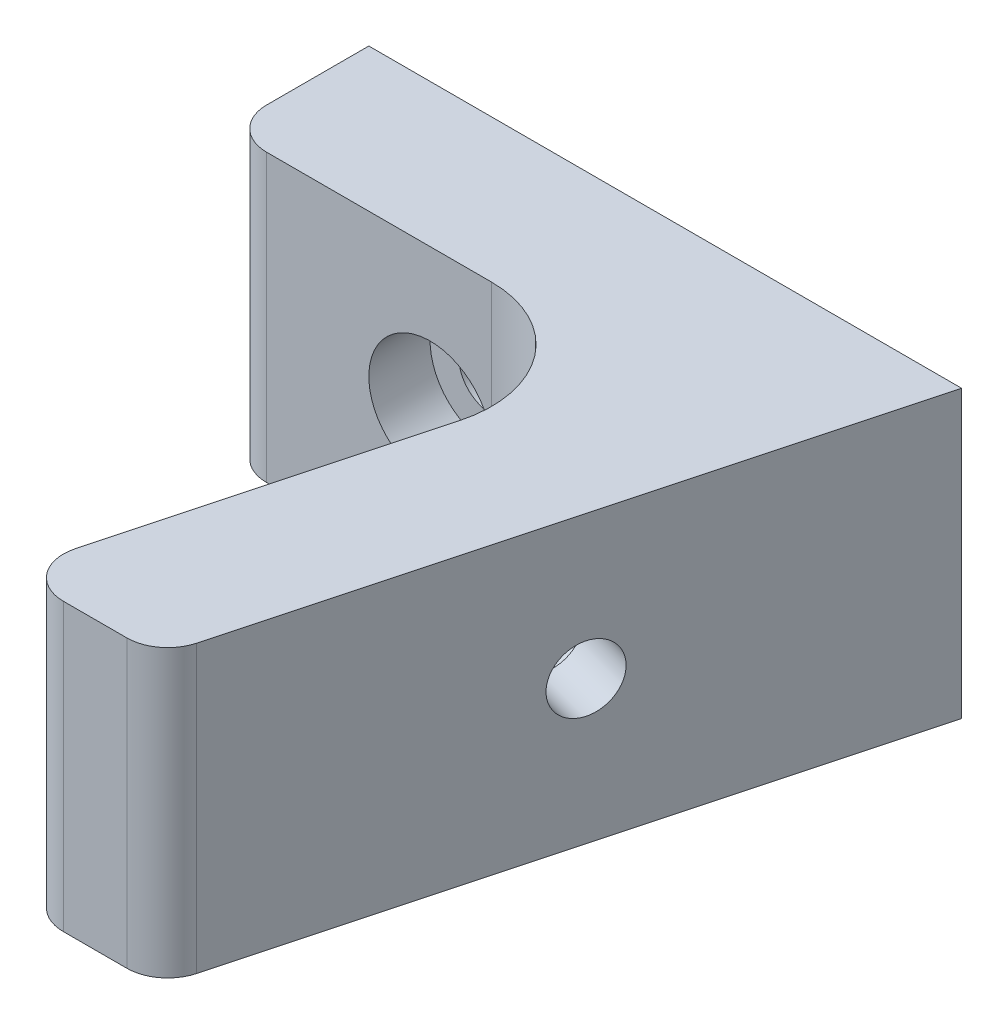
ISO-10303-21;
HEADER;
FILE_DESCRIPTION(('STEP AP214'),'2;1');
FILE_NAME('part.step','',(''),(''),'','','');
FILE_SCHEMA(('AUTOMOTIVE_DESIGN { 1 0 10303 214 1 1 1 1 }'));
ENDSEC;
DATA;
#1=APPLICATION_CONTEXT('core data for automotive mechanical design processes');
#2=APPLICATION_PROTOCOL_DEFINITION('international standard','automotive_design',2000,#1);
#3=PRODUCT_CONTEXT('',#1,'mechanical');
#4=PRODUCT('Part','Part','',(#3));
#5=PRODUCT_RELATED_PRODUCT_CATEGORY('part','',(#4));
#6=PRODUCT_DEFINITION_FORMATION('','',#4);
#7=PRODUCT_DEFINITION_CONTEXT('part definition',#1,'design');
#8=PRODUCT_DEFINITION('design','',#6,#7);
#9=PRODUCT_DEFINITION_SHAPE('','',#8);
#10=(LENGTH_UNIT() NAMED_UNIT(*) SI_UNIT(.MILLI.,.METRE.));
#11=(NAMED_UNIT(*) PLANE_ANGLE_UNIT() SI_UNIT($,.RADIAN.));
#12=(NAMED_UNIT(*) SI_UNIT($,.STERADIAN.) SOLID_ANGLE_UNIT());
#13=UNCERTAINTY_MEASURE_WITH_UNIT(LENGTH_MEASURE(1.E-05),#10,'distance_accuracy_value','');
#14=(GEOMETRIC_REPRESENTATION_CONTEXT(3) GLOBAL_UNCERTAINTY_ASSIGNED_CONTEXT((#13)) GLOBAL_UNIT_ASSIGNED_CONTEXT((#10,
#11,#12)) REPRESENTATION_CONTEXT('',''));
#15=CARTESIAN_POINT('',(0.,0.,0.));
#16=DIRECTION('',(0.,0.,1.));
#17=DIRECTION('',(1.,0.,0.));
#18=AXIS2_PLACEMENT_3D('',#15,#16,#17);
#19=CARTESIAN_POINT('',(-10.,7.,0.));
#20=DIRECTION('',(0.,0.,1.));
#21=DIRECTION('',(1.,0.,0.));
#22=AXIS2_PLACEMENT_3D('',#19,#20,#21);
#23=PLANE('',#22);
#24=CARTESIAN_POINT('',(0.,0.,0.));
#25=DIRECTION('',(0.,0.,1.));
#26=DIRECTION('',(1.,0.,0.));
#27=AXIS2_PLACEMENT_3D('',#24,#25,#26);
#28=CIRCLE('',#27,1.6);
#29=CARTESIAN_POINT('',(1.6,0.,0.));
#30=VERTEX_POINT('',#29);
#31=EDGE_CURVE('E217',#30,#30,#28,.T.);
#32=ORIENTED_EDGE('',*,*,#31,.T.);
#33=EDGE_LOOP('',(#32));
#34=FACE_BOUND('',#33,.T.);
#35=DIRECTION('',(-1.,0.,0.));
#36=VECTOR('',#35,1.);
#37=CARTESIAN_POINT('',(-10.,-7.,0.));
#38=LINE('',#37,#36);
#39=CARTESIAN_POINT('',(19.,-7.,0.));
#40=VERTEX_POINT('',#39);
#41=CARTESIAN_POINT('',(-10.,-7.,0.));
#42=VERTEX_POINT('',#41);
#43=EDGE_CURVE('E220',#40,#42,#38,.T.);
#44=ORIENTED_EDGE('',*,*,#43,.T.);
#45=DIRECTION('',(0.,-1.,0.));
#46=VECTOR('',#45,1.);
#47=CARTESIAN_POINT('',(-10.,7.,0.));
#48=LINE('',#47,#46);
#49=CARTESIAN_POINT('',(-10.,7.,0.));
#50=VERTEX_POINT('',#49);
#51=EDGE_CURVE('E267',#50,#42,#48,.T.);
#52=ORIENTED_EDGE('',*,*,#51,.F.);
#53=DIRECTION('',(-1.,0.,0.));
#54=VECTOR('',#53,1.);
#55=CARTESIAN_POINT('',(-10.,7.,0.));
#56=LINE('',#55,#54);
#57=CARTESIAN_POINT('',(19.,7.,0.));
#58=VERTEX_POINT('',#57);
#59=EDGE_CURVE('E221',#58,#50,#56,.T.);
#60=ORIENTED_EDGE('',*,*,#59,.F.);
#61=DIRECTION('',(0.,-1.,0.));
#62=VECTOR('',#61,1.);
#63=CARTESIAN_POINT('',(19.,7.,0.));
#64=LINE('',#63,#62);
#65=EDGE_CURVE('E239',#58,#40,#64,.T.);
#66=ORIENTED_EDGE('',*,*,#65,.T.);
#67=EDGE_LOOP('',(#44,#52,#60,#66));
#68=FACE_BOUND('',#67,.T.);
#69=ADVANCED_FACE('F32',(#34,#68),#23,.F.);
#70=CARTESIAN_POINT('',(-10.,7.,0.));
#71=DIRECTION('',(1.,0.,0.));
#72=DIRECTION('',(0.,0.,-1.));
#73=AXIS2_PLACEMENT_3D('',#70,#71,#72);
#74=PLANE('',#73);
#75=DIRECTION('',(0.,0.,1.));
#76=VECTOR('',#75,1.);
#77=CARTESIAN_POINT('',(-10.,-7.,0.));
#78=LINE('',#77,#76);
#79=CARTESIAN_POINT('',(-10.,-7.,5.));
#80=VERTEX_POINT('',#79);
#81=EDGE_CURVE('E242',#42,#80,#78,.T.);
#82=ORIENTED_EDGE('',*,*,#81,.T.);
#83=DIRECTION('',(0.,-1.,0.));
#84=VECTOR('',#83,1.);
#85=CARTESIAN_POINT('',(-10.,7.,5.));
#86=LINE('',#85,#84);
#87=CARTESIAN_POINT('',(-10.,7.,5.));
#88=VERTEX_POINT('',#87);
#89=EDGE_CURVE('E279',#80,#88,#86,.F.);
#90=ORIENTED_EDGE('',*,*,#89,.T.);
#91=DIRECTION('',(0.,0.,1.));
#92=VECTOR('',#91,1.);
#93=CARTESIAN_POINT('',(-10.,7.,0.));
#94=LINE('',#93,#92);
#95=EDGE_CURVE('E224',#50,#88,#94,.T.);
#96=ORIENTED_EDGE('',*,*,#95,.F.);
#97=ORIENTED_EDGE('',*,*,#51,.T.);
#98=EDGE_LOOP('',(#82,#90,#96,#97));
#99=FACE_BOUND('',#98,.T.);
#100=ADVANCED_FACE('F351',(#99),#74,.F.);
#101=CARTESIAN_POINT('',(-10.,7.,7.));
#102=DIRECTION('',(0.,0.,-1.));
#103=DIRECTION('',(-1.,0.,0.));
#104=AXIS2_PLACEMENT_3D('',#101,#102,#103);
#105=PLANE('',#104);
#106=DIRECTION('',(1.,0.,0.));
#107=VECTOR('',#106,1.);
#108=CARTESIAN_POINT('',(-10.,7.,7.));
#109=LINE('',#108,#107);
#110=CARTESIAN_POINT('',(-8.,7.,7.));
#111=VERTEX_POINT('',#110);
#112=CARTESIAN_POINT('',(3.,7.,7.));
#113=VERTEX_POINT('',#112);
#114=EDGE_CURVE('E228',#111,#113,#109,.T.);
#115=ORIENTED_EDGE('',*,*,#114,.F.);
#116=DIRECTION('',(0.,-1.,0.));
#117=VECTOR('',#116,1.);
#118=CARTESIAN_POINT('',(-8.,7.,7.));
#119=LINE('',#118,#117);
#120=CARTESIAN_POINT('',(-8.,-7.,7.));
#121=VERTEX_POINT('',#120);
#122=EDGE_CURVE('E270',#111,#121,#119,.T.);
#123=ORIENTED_EDGE('',*,*,#122,.T.);
#124=DIRECTION('',(1.,0.,0.));
#125=VECTOR('',#124,1.);
#126=CARTESIAN_POINT('',(-10.,-7.,7.));
#127=LINE('',#126,#125);
#128=CARTESIAN_POINT('',(3.,-7.,7.));
#129=VERTEX_POINT('',#128);
#130=EDGE_CURVE('E245',#121,#129,#127,.T.);
#131=ORIENTED_EDGE('',*,*,#130,.T.);
#132=DIRECTION('',(0.,-1.,0.));
#133=VECTOR('',#132,1.);
#134=CARTESIAN_POINT('',(3.,7.,7.));
#135=LINE('',#134,#133);
#136=CARTESIAN_POINT('',(3.,0.,7.));
#137=VERTEX_POINT('',#136);
#138=EDGE_CURVE('E263',#137,#129,#135,.T.);
#139=ORIENTED_EDGE('',*,*,#138,.F.);
#140=CARTESIAN_POINT('',(0.,0.,7.));
#141=DIRECTION('',(0.,0.,1.));
#142=DIRECTION('',(1.,0.,0.));
#143=AXIS2_PLACEMENT_3D('',#140,#141,#142);
#144=CIRCLE('',#143,3.);
#145=EDGE_CURVE('E209',#137,#137,#144,.T.);
#146=ORIENTED_EDGE('',*,*,#145,.F.);
#147=EDGE_CURVE('E264',#113,#137,#135,.T.);
#148=ORIENTED_EDGE('',*,*,#147,.F.);
#149=EDGE_LOOP('',(#115,#123,#131,#139,#146,#148));
#150=FACE_BOUND('',#149,.T.);
#151=ADVANCED_FACE('F359',(#150),#105,.F.);
#152=CARTESIAN_POINT('',(3.,7.,12.2772318076633));
#153=DIRECTION('',(0.,-1.,0.));
#154=DIRECTION('',(0.,0.,-1.));
#155=AXIS2_PLACEMENT_3D('',#152,#153,#154);
#156=CYLINDRICAL_SURFACE('',#155,5.27723180766331);
#157=DIRECTION('',(0.,-1.,0.));
#158=VECTOR('',#157,1.);
#159=CARTESIAN_POINT('',(8.09741449433614,7.,13.6430799049074));
#160=LINE('',#159,#158);
#161=CARTESIAN_POINT('',(8.09741449433613,-2.59807621135332,13.6430799049074));
#162=VERTEX_POINT('',#161);
#163=CARTESIAN_POINT('',(8.09741449433614,-7.,13.6430799049074));
#164=VERTEX_POINT('',#163);
#165=EDGE_CURVE('E259',#162,#164,#160,.T.);
#166=ORIENTED_EDGE('',*,*,#165,.F.);
#167=CARTESIAN_POINT('',(3.,-2.59807621135331,12.2772318076633));
#168=DIRECTION('',(-0.129409522551262,-0.866025403784439,0.482962913144534));
#169=DIRECTION('',(0.224143868042017,-0.5,-0.836516303737807));
#170=AXIS2_PLACEMENT_3D('',#167,#168,#169);
#171=ELLIPSE('',#170,6.09362240946094,5.27723180766331);
#172=CARTESIAN_POINT('',(8.26387866764209,-3.17542648054294,12.6524076653034));
#173=VERTEX_POINT('',#172);
#174=EDGE_CURVE('E203',#162,#173,#171,.F.);
#175=ORIENTED_EDGE('',*,*,#174,.T.);
#176=CARTESIAN_POINT('',(3.,-3.75277674973257,12.2772318076633));
#177=DIRECTION('',(0.129409522551262,-0.866025403784439,-0.482962913144533));
#178=DIRECTION('',(-0.224143868042017,-0.5,0.836516303737807));
#179=AXIS2_PLACEMENT_3D('',#176,#177,#178);
#180=ELLIPSE('',#179,6.09362240946094,5.27723180766331);
#181=CARTESIAN_POINT('',(7.55709388619205,-1.58771324027147,9.61601575776348));
#182=VERTEX_POINT('',#181);
#183=EDGE_CURVE('E11',#173,#182,#180,.F.);
#184=ORIENTED_EDGE('',*,*,#183,.T.);
#185=DIRECTION('',(0.,-1.,0.));
#186=VECTOR('',#185,1.);
#187=CARTESIAN_POINT('',(7.55709388619205,7.,9.61601575776348));
#188=LINE('',#187,#186);
#189=CARTESIAN_POINT('',(7.55709388619205,1.58771324027147,9.61601575776348));
#190=VERTEX_POINT('',#189);
#191=EDGE_CURVE('E40',#182,#190,#188,.F.);
#192=ORIENTED_EDGE('',*,*,#191,.T.);
#193=CARTESIAN_POINT('',(3.,3.75277674973257,12.2772318076633));
#194=DIRECTION('',(0.129409522551262,0.866025403784439,-0.482962913144534));
#195=DIRECTION('',(0.224143868042017,-0.5,-0.836516303737807));
#196=AXIS2_PLACEMENT_3D('',#193,#194,#195);
#197=ELLIPSE('',#196,6.09362240946094,5.27723180766331);
#198=CARTESIAN_POINT('',(8.26387866764209,3.17542648054294,12.6524076653034));
#199=VERTEX_POINT('',#198);
#200=EDGE_CURVE('E161',#190,#199,#197,.F.);
#201=ORIENTED_EDGE('',*,*,#200,.T.);
#202=CARTESIAN_POINT('',(3.,2.59807621135332,12.2772318076633));
#203=DIRECTION('',(-0.129409522551262,0.866025403784439,0.482962913144533));
#204=DIRECTION('',(-0.224143868042017,-0.5,0.836516303737807));
#205=AXIS2_PLACEMENT_3D('',#202,#203,#204);
#206=ELLIPSE('',#205,6.09362240946094,5.27723180766331);
#207=CARTESIAN_POINT('',(8.09741449433613,2.59807621135332,13.6430799049074));
#208=VERTEX_POINT('',#207);
#209=EDGE_CURVE('E200',#199,#208,#206,.F.);
#210=ORIENTED_EDGE('',*,*,#209,.T.);
#211=CARTESIAN_POINT('',(8.09741449433614,7.,13.6430799049074));
#212=VERTEX_POINT('',#211);
#213=EDGE_CURVE('E260',#212,#208,#160,.T.);
#214=ORIENTED_EDGE('',*,*,#213,.F.);
#215=CARTESIAN_POINT('',(3.,7.,12.2772318076633));
#216=DIRECTION('',(0.,-1.,0.));
#217=DIRECTION('',(0.,0.,-1.));
#218=AXIS2_PLACEMENT_3D('',#215,#216,#217);
#219=CIRCLE('',#218,5.27723180766331);
#220=EDGE_CURVE('E230',#113,#212,#219,.T.);
#221=ORIENTED_EDGE('',*,*,#220,.F.);
#222=ORIENTED_EDGE('',*,*,#147,.T.);
#223=ORIENTED_EDGE('',*,*,#138,.T.);
#224=CARTESIAN_POINT('',(3.,-7.,12.2772318076633));
#225=DIRECTION('',(0.,-1.,0.));
#226=DIRECTION('',(0.,0.,-1.));
#227=AXIS2_PLACEMENT_3D('',#224,#225,#226);
#228=CIRCLE('',#227,5.27723180766331);
#229=EDGE_CURVE('E247',#129,#164,#228,.T.);
#230=ORIENTED_EDGE('',*,*,#229,.T.);
#231=EDGE_LOOP('',(#166,#175,#184,#192,#201,#210,#214,#221,#222,#223,#230));
#232=FACE_BOUND('',#231,.T.);
#233=ADVANCED_FACE('F309',(#232),#156,.F.);
#234=CARTESIAN_POINT('',(8.09741449433613,7.,13.6430799049074));
#235=DIRECTION('',(0.965925826289067,0.,0.258819045102525));
#236=DIRECTION('',(0.258819045102525,0.,-0.965925826289067));
#237=AXIS2_PLACEMENT_3D('',#234,#235,#236);
#238=PLANE('',#237);
#239=DIRECTION('',(0.,-1.,0.));
#240=VECTOR('',#239,1.);
#241=CARTESIAN_POINT('',(7.64448116540671,7.,15.3334501009133));
#242=LINE('',#241,#240);
#243=CARTESIAN_POINT('',(7.64448116540671,1.58771324027147,15.3334501009133));
#244=VERTEX_POINT('',#243);
#245=CARTESIAN_POINT('',(7.64448116540671,-1.58771324027147,15.3334501009133));
#246=VERTEX_POINT('',#245);
#247=EDGE_CURVE('E301',#244,#246,#242,.T.);
#248=ORIENTED_EDGE('',*,*,#247,.T.);
#249=DIRECTION('',(0.224143868042017,-0.5,-0.836516303737807));
#250=VECTOR('',#249,1.);
#251=CARTESIAN_POINT('',(7.02173953044873,-0.198557158514987,17.6575535225649));
#252=LINE('',#251,#250);
#253=EDGE_CURVE('E304',#246,#162,#252,.T.);
#254=ORIENTED_EDGE('',*,*,#253,.T.);
#255=ORIENTED_EDGE('',*,*,#165,.T.);
#256=DIRECTION('',(-0.258819045102525,0.,0.965925826289067));
#257=VECTOR('',#256,1.);
#258=CARTESIAN_POINT('',(8.09741449433613,-7.,13.6430799049074));
#259=LINE('',#258,#257);
#260=CARTESIAN_POINT('',(4.12124086486876,-7.,28.4823619097949));
#261=VERTEX_POINT('',#260);
#262=EDGE_CURVE('E250',#164,#261,#259,.T.);
#263=ORIENTED_EDGE('',*,*,#262,.T.);
#264=DIRECTION('',(0.,-1.,0.));
#265=VECTOR('',#264,1.);
#266=CARTESIAN_POINT('',(4.12124086486876,7.,28.4823619097949));
#267=LINE('',#266,#265);
#268=CARTESIAN_POINT('',(4.12124086486876,7.,28.4823619097949));
#269=VERTEX_POINT('',#268);
#270=EDGE_CURVE('E291',#261,#269,#267,.F.);
#271=ORIENTED_EDGE('',*,*,#270,.T.);
#272=DIRECTION('',(-0.258819045102525,0.,0.965925826289067));
#273=VECTOR('',#272,1.);
#274=CARTESIAN_POINT('',(8.09741449433613,7.,13.6430799049074));
#275=LINE('',#274,#273);
#276=EDGE_CURVE('E232',#212,#269,#275,.T.);
#277=ORIENTED_EDGE('',*,*,#276,.F.);
#278=ORIENTED_EDGE('',*,*,#213,.T.);
#279=DIRECTION('',(-0.224143868042017,-0.5,0.836516303737807));
#280=VECTOR('',#279,1.);
#281=CARTESIAN_POINT('',(8.59074660674285,3.69855715851499,11.8019393964003));
#282=LINE('',#281,#280);
#283=EDGE_CURVE('E296',#208,#244,#282,.T.);
#284=ORIENTED_EDGE('',*,*,#283,.T.);
#285=EDGE_LOOP('',(#248,#254,#255,#263,#271,#277,#278,#284));
#286=FACE_BOUND('',#285,.T.);
#287=ADVANCED_FACE('F319',(#286),#238,.F.);
#288=CARTESIAN_POINT('',(3.44664177176447,7.,31.));
#289=DIRECTION('',(0.,0.,-1.));
#290=DIRECTION('',(-1.,0.,0.));
#291=AXIS2_PLACEMENT_3D('',#288,#289,#290);
#292=PLANE('',#291);
#293=DIRECTION('',(1.,0.,0.));
#294=VECTOR('',#293,1.);
#295=CARTESIAN_POINT('',(3.44664177176447,7.,31.));
#296=LINE('',#295,#294);
#297=CARTESIAN_POINT('',(6.05309251744689,7.,31.));
#298=VERTEX_POINT('',#297);
#299=CARTESIAN_POINT('',(9.15892105867714,7.,31.));
#300=VERTEX_POINT('',#299);
#301=EDGE_CURVE('E235',#298,#300,#296,.T.);
#302=ORIENTED_EDGE('',*,*,#301,.F.);
#303=DIRECTION('',(0.,-1.,0.));
#304=VECTOR('',#303,1.);
#305=CARTESIAN_POINT('',(6.05309251744689,7.,31.));
#306=LINE('',#305,#304);
#307=CARTESIAN_POINT('',(6.05309251744689,-7.,31.));
#308=VERTEX_POINT('',#307);
#309=EDGE_CURVE('E288',#298,#308,#306,.T.);
#310=ORIENTED_EDGE('',*,*,#309,.T.);
#311=DIRECTION('',(1.,0.,0.));
#312=VECTOR('',#311,1.);
#313=CARTESIAN_POINT('',(3.44664177176447,-7.,31.));
#314=LINE('',#313,#312);
#315=CARTESIAN_POINT('',(9.15892105867714,-7.,31.));
#316=VERTEX_POINT('',#315);
#317=EDGE_CURVE('E253',#308,#316,#314,.T.);
#318=ORIENTED_EDGE('',*,*,#317,.T.);
#319=DIRECTION('',(0.,-1.,0.));
#320=VECTOR('',#319,1.);
#321=CARTESIAN_POINT('',(9.15892105867714,7.,31.));
#322=LINE('',#321,#320);
#323=EDGE_CURVE('E286',#316,#300,#322,.F.);
#324=ORIENTED_EDGE('',*,*,#323,.T.);
#325=EDGE_LOOP('',(#302,#310,#318,#324));
#326=FACE_BOUND('',#325,.T.);
#327=ADVANCED_FACE('F333',(#326),#292,.F.);
#328=CARTESIAN_POINT('',(19.,7.,0.));
#329=DIRECTION('',(-0.965925826289067,0.,-0.258819045102525));
#330=DIRECTION('',(-0.258819045102525,0.,0.965925826289067));
#331=AXIS2_PLACEMENT_3D('',#328,#329,#330);
#332=PLANE('',#331);
#333=CARTESIAN_POINT('',(15.1177143234621,0.,14.488887394336));
#334=DIRECTION('',(0.965925826289067,0.,0.258819045102525));
#335=DIRECTION('',(0.258819045102525,0.,-0.965925826289067));
#336=AXIS2_PLACEMENT_3D('',#333,#334,#335);
#337=CIRCLE('',#336,1.6);
#338=CARTESIAN_POINT('',(15.5318247956262,0.,12.9434060722735));
#339=VERTEX_POINT('',#338);
#340=EDGE_CURVE('E206',#339,#339,#337,.T.);
#341=ORIENTED_EDGE('',*,*,#340,.F.);
#342=EDGE_LOOP('',(#341));
#343=FACE_BOUND('',#342,.T.);
#344=DIRECTION('',(0.258819045102525,0.,-0.965925826289067));
#345=VECTOR('',#344,1.);
#346=CARTESIAN_POINT('',(19.,7.,0.));
#347=LINE('',#346,#345);
#348=CARTESIAN_POINT('',(11.0907727112553,7.,29.517638090205));
#349=VERTEX_POINT('',#348);
#350=EDGE_CURVE('E237',#349,#58,#347,.T.);
#351=ORIENTED_EDGE('',*,*,#350,.F.);
#352=DIRECTION('',(0.,-1.,0.));
#353=VECTOR('',#352,1.);
#354=CARTESIAN_POINT('',(11.0907727112553,7.,29.517638090205));
#355=LINE('',#354,#353);
#356=CARTESIAN_POINT('',(11.0907727112553,-7.,29.517638090205));
#357=VERTEX_POINT('',#356);
#358=EDGE_CURVE('E293',#349,#357,#355,.T.);
#359=ORIENTED_EDGE('',*,*,#358,.T.);
#360=DIRECTION('',(0.258819045102525,0.,-0.965925826289067));
#361=VECTOR('',#360,1.);
#362=CARTESIAN_POINT('',(19.,-7.,0.));
#363=LINE('',#362,#361);
#364=EDGE_CURVE('E225',#357,#40,#363,.T.);
#365=ORIENTED_EDGE('',*,*,#364,.T.);
#366=ORIENTED_EDGE('',*,*,#65,.F.);
#367=EDGE_LOOP('',(#351,#359,#365,#366));
#368=FACE_BOUND('',#367,.T.);
#369=ADVANCED_FACE('F344',(#343,#368),#332,.F.);
#370=CARTESIAN_POINT('',(3.,7.,12.2772318076633));
#371=DIRECTION('',(0.,-1.,0.));
#372=DIRECTION('',(0.,0.,-1.));
#373=AXIS2_PLACEMENT_3D('',#370,#371,#372);
#374=PLANE('',#373);
#375=ORIENTED_EDGE('',*,*,#95,.T.);
#376=CARTESIAN_POINT('',(-8.,7.,5.));
#377=DIRECTION('',(0.,-1.,0.));
#378=DIRECTION('',(0.,0.,-1.));
#379=AXIS2_PLACEMENT_3D('',#376,#377,#378);
#380=CIRCLE('',#379,2.);
#381=EDGE_CURVE('E284',#88,#111,#380,.F.);
#382=ORIENTED_EDGE('',*,*,#381,.T.);
#383=ORIENTED_EDGE('',*,*,#114,.T.);
#384=ORIENTED_EDGE('',*,*,#220,.T.);
#385=ORIENTED_EDGE('',*,*,#276,.T.);
#386=CARTESIAN_POINT('',(6.05309251744689,7.,29.));
#387=DIRECTION('',(0.,-1.,0.));
#388=DIRECTION('',(0.,0.,-1.));
#389=AXIS2_PLACEMENT_3D('',#386,#387,#388);
#390=CIRCLE('',#389,2.);
#391=EDGE_CURVE('E282',#269,#298,#390,.F.);
#392=ORIENTED_EDGE('',*,*,#391,.T.);
#393=ORIENTED_EDGE('',*,*,#301,.T.);
#394=CARTESIAN_POINT('',(9.15892105867714,7.,29.));
#395=DIRECTION('',(0.,-1.,0.));
#396=DIRECTION('',(0.,0.,-1.));
#397=AXIS2_PLACEMENT_3D('',#394,#395,#396);
#398=CIRCLE('',#397,2.);
#399=EDGE_CURVE('E55',#300,#349,#398,.F.);
#400=ORIENTED_EDGE('',*,*,#399,.T.);
#401=ORIENTED_EDGE('',*,*,#350,.T.);
#402=ORIENTED_EDGE('',*,*,#59,.T.);
#403=EDGE_LOOP('',(#375,#382,#383,#384,#385,#392,#393,#400,#401,#402));
#404=FACE_BOUND('',#403,.T.);
#405=ADVANCED_FACE('F326',(#404),#374,.F.);
#406=CARTESIAN_POINT('',(3.,-7.,12.2772318076633));
#407=DIRECTION('',(0.,-1.,0.));
#408=DIRECTION('',(0.,0.,-1.));
#409=AXIS2_PLACEMENT_3D('',#406,#407,#408);
#410=PLANE('',#409);
#411=ORIENTED_EDGE('',*,*,#130,.F.);
#412=CARTESIAN_POINT('',(-8.,-7.,5.));
#413=DIRECTION('',(0.,-1.,0.));
#414=DIRECTION('',(0.,0.,-1.));
#415=AXIS2_PLACEMENT_3D('',#412,#413,#414);
#416=CIRCLE('',#415,2.);
#417=EDGE_CURVE('E277',#121,#80,#416,.T.);
#418=ORIENTED_EDGE('',*,*,#417,.T.);
#419=ORIENTED_EDGE('',*,*,#81,.F.);
#420=ORIENTED_EDGE('',*,*,#43,.F.);
#421=ORIENTED_EDGE('',*,*,#364,.F.);
#422=CARTESIAN_POINT('',(9.15892105867714,-7.,29.));
#423=DIRECTION('',(0.,-1.,0.));
#424=DIRECTION('',(0.,0.,-1.));
#425=AXIS2_PLACEMENT_3D('',#422,#423,#424);
#426=CIRCLE('',#425,2.);
#427=EDGE_CURVE('E273',#357,#316,#426,.T.);
#428=ORIENTED_EDGE('',*,*,#427,.T.);
#429=ORIENTED_EDGE('',*,*,#317,.F.);
#430=CARTESIAN_POINT('',(6.05309251744689,-7.,29.));
#431=DIRECTION('',(0.,-1.,0.));
#432=DIRECTION('',(0.,0.,-1.));
#433=AXIS2_PLACEMENT_3D('',#430,#431,#432);
#434=CIRCLE('',#433,2.);
#435=EDGE_CURVE('E275',#308,#261,#434,.T.);
#436=ORIENTED_EDGE('',*,*,#435,.T.);
#437=ORIENTED_EDGE('',*,*,#262,.F.);
#438=ORIENTED_EDGE('',*,*,#229,.F.);
#439=EDGE_LOOP('',(#411,#418,#419,#420,#421,#428,#429,#436,#437,#438));
#440=FACE_BOUND('',#439,.T.);
#441=ADVANCED_FACE('F337',(#440),#410,.T.);
#442=CARTESIAN_POINT('',(0.,0.,7.));
#443=DIRECTION('',(0.,0.,1.));
#444=DIRECTION('',(1.,0.,0.));
#445=AXIS2_PLACEMENT_3D('',#442,#443,#444);
#446=CYLINDRICAL_SURFACE('',#445,1.6);
#447=ORIENTED_EDGE('',*,*,#31,.F.);
#448=EDGE_LOOP('',(#447));
#449=FACE_BOUND('',#448,.T.);
#450=CARTESIAN_POINT('',(0.,0.,4.));
#451=DIRECTION('',(0.,0.,1.));
#452=DIRECTION('',(1.,0.,0.));
#453=AXIS2_PLACEMENT_3D('',#450,#451,#452);
#454=CIRCLE('',#453,1.6);
#455=CARTESIAN_POINT('',(1.6,0.,4.));
#456=VERTEX_POINT('',#455);
#457=EDGE_CURVE('E214',#456,#456,#454,.T.);
#458=ORIENTED_EDGE('',*,*,#457,.T.);
#459=EDGE_LOOP('',(#458));
#460=FACE_BOUND('',#459,.T.);
#461=ADVANCED_FACE('F407',(#449,#460),#446,.F.);
#462=CARTESIAN_POINT('',(1.6,0.,4.));
#463=DIRECTION('',(0.,0.,-1.));
#464=DIRECTION('',(-1.,0.,0.));
#465=AXIS2_PLACEMENT_3D('',#462,#463,#464);
#466=PLANE('',#465);
#467=ORIENTED_EDGE('',*,*,#457,.F.);
#468=EDGE_LOOP('',(#467));
#469=FACE_BOUND('',#468,.T.);
#470=CARTESIAN_POINT('',(0.,0.,4.));
#471=DIRECTION('',(0.,0.,1.));
#472=DIRECTION('',(1.,0.,0.));
#473=AXIS2_PLACEMENT_3D('',#470,#471,#472);
#474=CIRCLE('',#473,3.);
#475=CARTESIAN_POINT('',(3.,0.,4.));
#476=VERTEX_POINT('',#475);
#477=EDGE_CURVE('E211',#476,#476,#474,.T.);
#478=ORIENTED_EDGE('',*,*,#477,.T.);
#479=EDGE_LOOP('',(#478));
#480=FACE_BOUND('',#479,.T.);
#481=ADVANCED_FACE('F403',(#469,#480),#466,.F.);
#482=CARTESIAN_POINT('',(0.,0.,7.));
#483=DIRECTION('',(0.,0.,1.));
#484=DIRECTION('',(1.,0.,0.));
#485=AXIS2_PLACEMENT_3D('',#482,#483,#484);
#486=CYLINDRICAL_SURFACE('',#485,3.);
#487=ORIENTED_EDGE('',*,*,#477,.F.);
#488=EDGE_LOOP('',(#487));
#489=FACE_BOUND('',#488,.T.);
#490=ORIENTED_EDGE('',*,*,#145,.T.);
#491=EDGE_LOOP('',(#490));
#492=FACE_BOUND('',#491,.T.);
#493=ADVANCED_FACE('F384',(#489,#492),#486,.F.);
#494=CARTESIAN_POINT('',(-8.,7.,5.));
#495=DIRECTION('',(0.,-1.,0.));
#496=DIRECTION('',(0.,0.,-1.));
#497=AXIS2_PLACEMENT_3D('',#494,#495,#496);
#498=CYLINDRICAL_SURFACE('',#497,2.);
#499=ORIENTED_EDGE('',*,*,#381,.F.);
#500=ORIENTED_EDGE('',*,*,#89,.F.);
#501=ORIENTED_EDGE('',*,*,#417,.F.);
#502=ORIENTED_EDGE('',*,*,#122,.F.);
#503=EDGE_LOOP('',(#499,#500,#501,#502));
#504=FACE_BOUND('',#503,.T.);
#505=ADVANCED_FACE('F354',(#504),#498,.T.);
#506=CARTESIAN_POINT('',(6.05309251744689,7.,29.));
#507=DIRECTION('',(0.,-1.,0.));
#508=DIRECTION('',(0.,0.,-1.));
#509=AXIS2_PLACEMENT_3D('',#506,#507,#508);
#510=CYLINDRICAL_SURFACE('',#509,2.);
#511=ORIENTED_EDGE('',*,*,#391,.F.);
#512=ORIENTED_EDGE('',*,*,#270,.F.);
#513=ORIENTED_EDGE('',*,*,#435,.F.);
#514=ORIENTED_EDGE('',*,*,#309,.F.);
#515=EDGE_LOOP('',(#511,#512,#513,#514));
#516=FACE_BOUND('',#515,.T.);
#517=ADVANCED_FACE('F330',(#516),#510,.T.);
#518=CARTESIAN_POINT('',(9.15892105867714,7.,29.));
#519=DIRECTION('',(0.,-1.,0.));
#520=DIRECTION('',(0.,0.,-1.));
#521=AXIS2_PLACEMENT_3D('',#518,#519,#520);
#522=CYLINDRICAL_SURFACE('',#521,2.);
#523=ORIENTED_EDGE('',*,*,#399,.F.);
#524=ORIENTED_EDGE('',*,*,#323,.F.);
#525=ORIENTED_EDGE('',*,*,#427,.F.);
#526=ORIENTED_EDGE('',*,*,#358,.F.);
#527=EDGE_LOOP('',(#523,#524,#525,#526));
#528=FACE_BOUND('',#527,.T.);
#529=ADVANCED_FACE('F34',(#528),#522,.T.);
#530=CARTESIAN_POINT('',(5.45845606057147,0.,11.9006969433108));
#531=DIRECTION('',(0.965925826289067,0.,0.258819045102525));
#532=DIRECTION('',(0.258819045102525,0.,-0.965925826289067));
#533=AXIS2_PLACEMENT_3D('',#530,#531,#532);
#534=CYLINDRICAL_SURFACE('',#533,1.6);
#535=CARTESIAN_POINT('',(12.2199368445949,0.,13.7124302590284));
#536=DIRECTION('',(0.965925826289067,0.,0.258819045102525));
#537=DIRECTION('',(0.258819045102525,0.,-0.965925826289067));
#538=AXIS2_PLACEMENT_3D('',#535,#536,#537);
#539=CIRCLE('',#538,1.6);
#540=CARTESIAN_POINT('',(12.634047316759,0.,12.1669489369659));
#541=VERTEX_POINT('',#540);
#542=EDGE_CURVE('E193',#541,#541,#539,.F.);
#543=ORIENTED_EDGE('',*,*,#542,.T.);
#544=EDGE_LOOP('',(#543));
#545=FACE_BOUND('',#544,.T.);
#546=ORIENTED_EDGE('',*,*,#340,.T.);
#547=EDGE_LOOP('',(#546));
#548=FACE_BOUND('',#547,.T.);
#549=ADVANCED_FACE('F389',(#545,#548),#534,.F.);
#550=CARTESIAN_POINT('',(6.17020843460341,-1.58771324027147,9.24440092101583));
#551=DIRECTION('',(0.258819045102525,0.,-0.965925826289067));
#552=DIRECTION('',(-0.965925826289067,0.,-0.258819045102525));
#553=AXIS2_PLACEMENT_3D('',#550,#551,#552);
#554=PLANE('',#553);
#555=DIRECTION('',(0.965925826289067,0.,0.258819045102525));
#556=VECTOR('',#555,1.);
#557=CARTESIAN_POINT('',(6.17020843460341,-1.58771324027147,9.24440092101583));
#558=LINE('',#557,#556);
#559=CARTESIAN_POINT('',(12.9316892186269,-1.58771324027147,11.0561342367335));
#560=VERTEX_POINT('',#559);
#561=EDGE_CURVE('E181',#182,#560,#558,.T.);
#562=ORIENTED_EDGE('',*,*,#561,.T.);
#563=DIRECTION('',(0.,1.,0.));
#564=VECTOR('',#563,1.);
#565=CARTESIAN_POINT('',(12.9316892186269,-1.58771324027147,11.0561342367335));
#566=LINE('',#565,#564);
#567=CARTESIAN_POINT('',(12.9316892186269,1.58771324027147,11.0561342367335));
#568=VERTEX_POINT('',#567);
#569=EDGE_CURVE('E174',#560,#568,#566,.T.);
#570=ORIENTED_EDGE('',*,*,#569,.T.);
#571=DIRECTION('',(0.965925826289067,0.,0.258819045102525));
#572=VECTOR('',#571,1.);
#573=CARTESIAN_POINT('',(6.17020843460341,1.58771324027147,9.24440092101583));
#574=LINE('',#573,#572);
#575=EDGE_CURVE('E155',#190,#568,#574,.T.);
#576=ORIENTED_EDGE('',*,*,#575,.F.);
#577=ORIENTED_EDGE('',*,*,#191,.F.);
#578=EDGE_LOOP('',(#562,#570,#576,#577));
#579=FACE_BOUND('',#578,.T.);
#580=ADVANCED_FACE('F179',(#579),#554,.F.);
#581=CARTESIAN_POINT('',(5.45845606057147,-3.17542648054294,11.9006969433108));
#582=DIRECTION('',(0.129409522551262,-0.866025403784439,-0.482962913144533));
#583=DIRECTION('',(0.,0.487058473848148,-0.873369362327711));
#584=AXIS2_PLACEMENT_3D('',#581,#582,#583);
#585=PLANE('',#584);
#586=DIRECTION('',(0.965925826289067,0.,0.258819045102525));
#587=VECTOR('',#586,1.);
#588=CARTESIAN_POINT('',(5.45845606057147,-3.17542648054294,11.9006969433108));
#589=LINE('',#588,#587);
#590=CARTESIAN_POINT('',(12.2199368445949,-3.17542648054294,13.7124302590284));
#591=VERTEX_POINT('',#590);
#592=EDGE_CURVE('E194',#173,#591,#589,.T.);
#593=ORIENTED_EDGE('',*,*,#592,.T.);
#594=DIRECTION('',(0.224143868042017,0.5,-0.836516303737807));
#595=VECTOR('',#594,1.);
#596=CARTESIAN_POINT('',(12.2199368445949,-3.17542648054294,13.7124302590284));
#597=LINE('',#596,#595);
#598=EDGE_CURVE('E166',#591,#560,#597,.T.);
#599=ORIENTED_EDGE('',*,*,#598,.T.);
#600=ORIENTED_EDGE('',*,*,#561,.F.);
#601=ORIENTED_EDGE('',*,*,#183,.F.);
#602=EDGE_LOOP('',(#593,#599,#600,#601));
#603=FACE_BOUND('',#602,.T.);
#604=ADVANCED_FACE('F311',(#603),#585,.F.);
#605=CARTESIAN_POINT('',(6.17020843460341,1.58771324027147,9.24440092101583));
#606=DIRECTION('',(0.129409522551262,0.866025403784439,-0.482962913144534));
#607=DIRECTION('',(0.,0.487058473848148,0.873369362327711));
#608=AXIS2_PLACEMENT_3D('',#605,#606,#607);
#609=PLANE('',#608);
#610=ORIENTED_EDGE('',*,*,#575,.T.);
#611=DIRECTION('',(-0.224143868042017,0.5,0.836516303737807));
#612=VECTOR('',#611,1.);
#613=CARTESIAN_POINT('',(12.9316892186269,1.58771324027147,11.0561342367335));
#614=LINE('',#613,#612);
#615=CARTESIAN_POINT('',(12.2199368445949,3.17542648054294,13.7124302590284));
#616=VERTEX_POINT('',#615);
#617=EDGE_CURVE('E159',#568,#616,#614,.T.);
#618=ORIENTED_EDGE('',*,*,#617,.T.);
#619=DIRECTION('',(0.965925826289067,0.,0.258819045102525));
#620=VECTOR('',#619,1.);
#621=CARTESIAN_POINT('',(5.45845606057147,3.17542648054294,11.9006969433108));
#622=LINE('',#621,#620);
#623=EDGE_CURVE('E165',#199,#616,#622,.T.);
#624=ORIENTED_EDGE('',*,*,#623,.F.);
#625=ORIENTED_EDGE('',*,*,#200,.F.);
#626=EDGE_LOOP('',(#610,#618,#624,#625));
#627=FACE_BOUND('',#626,.T.);
#628=ADVANCED_FACE('F157',(#627),#609,.F.);
#629=CARTESIAN_POINT('',(4.74670368653952,-1.58771324027147,14.5569929656057));
#630=DIRECTION('',(-0.129409522551262,-0.866025403784439,0.482962913144534));
#631=DIRECTION('',(0.,-0.487058473848148,-0.873369362327711));
#632=AXIS2_PLACEMENT_3D('',#629,#630,#631);
#633=PLANE('',#632);
#634=ORIENTED_EDGE('',*,*,#253,.F.);
#635=DIRECTION('',(0.965925826289067,0.,0.258819045102525));
#636=VECTOR('',#635,1.);
#637=CARTESIAN_POINT('',(4.74670368653952,-1.58771324027147,14.5569929656057));
#638=LINE('',#637,#636);
#639=CARTESIAN_POINT('',(11.508184470563,-1.58771324027147,16.3687262813234));
#640=VERTEX_POINT('',#639);
#641=EDGE_CURVE('E196',#246,#640,#638,.T.);
#642=ORIENTED_EDGE('',*,*,#641,.T.);
#643=DIRECTION('',(0.224143868042017,-0.5,-0.836516303737807));
#644=VECTOR('',#643,1.);
#645=CARTESIAN_POINT('',(11.508184470563,-1.58771324027147,16.3687262813234));
#646=LINE('',#645,#644);
#647=EDGE_CURVE('E188',#640,#591,#646,.T.);
#648=ORIENTED_EDGE('',*,*,#647,.T.);
#649=ORIENTED_EDGE('',*,*,#592,.F.);
#650=ORIENTED_EDGE('',*,*,#174,.F.);
#651=EDGE_LOOP('',(#634,#642,#648,#649,#650));
#652=FACE_BOUND('',#651,.T.);
#653=ADVANCED_FACE('F364',(#652),#633,.F.);
#654=CARTESIAN_POINT('',(4.74670368653952,1.58771324027147,14.5569929656057));
#655=DIRECTION('',(-0.258819045102525,0.,0.965925826289067));
#656=DIRECTION('',(0.965925826289067,0.,0.258819045102525));
#657=AXIS2_PLACEMENT_3D('',#654,#655,#656);
#658=PLANE('',#657);
#659=DIRECTION('',(0.965925826289067,0.,0.258819045102525));
#660=VECTOR('',#659,1.);
#661=CARTESIAN_POINT('',(4.74670368653952,1.58771324027147,14.5569929656057));
#662=LINE('',#661,#660);
#663=CARTESIAN_POINT('',(11.508184470563,1.58771324027147,16.3687262813234));
#664=VERTEX_POINT('',#663);
#665=EDGE_CURVE('E47',#244,#664,#662,.T.);
#666=ORIENTED_EDGE('',*,*,#665,.T.);
#667=DIRECTION('',(0.,-1.,0.));
#668=VECTOR('',#667,1.);
#669=CARTESIAN_POINT('',(11.508184470563,1.58771324027147,16.3687262813234));
#670=LINE('',#669,#668);
#671=EDGE_CURVE('E185',#664,#640,#670,.T.);
#672=ORIENTED_EDGE('',*,*,#671,.T.);
#673=ORIENTED_EDGE('',*,*,#641,.F.);
#674=ORIENTED_EDGE('',*,*,#247,.F.);
#675=EDGE_LOOP('',(#666,#672,#673,#674));
#676=FACE_BOUND('',#675,.T.);
#677=ADVANCED_FACE('F317',(#676),#658,.F.);
#678=CARTESIAN_POINT('',(5.45845606057147,3.17542648054294,11.9006969433108));
#679=DIRECTION('',(-0.129409522551262,0.866025403784439,0.482962913144533));
#680=DIRECTION('',(0.,-0.487058473848148,0.873369362327711));
#681=AXIS2_PLACEMENT_3D('',#678,#679,#680);
#682=PLANE('',#681);
#683=ORIENTED_EDGE('',*,*,#623,.T.);
#684=DIRECTION('',(-0.224143868042017,-0.5,0.836516303737807));
#685=VECTOR('',#684,1.);
#686=CARTESIAN_POINT('',(12.2199368445949,3.17542648054294,13.7124302590284));
#687=LINE('',#686,#685);
#688=EDGE_CURVE('E177',#616,#664,#687,.T.);
#689=ORIENTED_EDGE('',*,*,#688,.T.);
#690=ORIENTED_EDGE('',*,*,#665,.F.);
#691=ORIENTED_EDGE('',*,*,#283,.F.);
#692=ORIENTED_EDGE('',*,*,#209,.F.);
#693=EDGE_LOOP('',(#683,#689,#690,#691,#692));
#694=FACE_BOUND('',#693,.T.);
#695=ADVANCED_FACE('F322',(#694),#682,.F.);
#696=CARTESIAN_POINT('',(14.8294638570849,0.,3.9735428646925));
#697=DIRECTION('',(0.965925826289067,0.,0.258819045102525));
#698=DIRECTION('',(0.258819045102525,0.,-0.965925826289067));
#699=AXIS2_PLACEMENT_3D('',#696,#697,#698);
#700=PLANE('',#699);
#701=ORIENTED_EDGE('',*,*,#569,.F.);
#702=ORIENTED_EDGE('',*,*,#598,.F.);
#703=ORIENTED_EDGE('',*,*,#647,.F.);
#704=ORIENTED_EDGE('',*,*,#671,.F.);
#705=ORIENTED_EDGE('',*,*,#688,.F.);
#706=ORIENTED_EDGE('',*,*,#617,.F.);
#707=EDGE_LOOP('',(#701,#702,#703,#704,#705,#706));
#708=FACE_BOUND('',#707,.T.);
#709=ORIENTED_EDGE('',*,*,#542,.F.);
#710=EDGE_LOOP('',(#709));
#711=FACE_BOUND('',#710,.T.);
#712=ADVANCED_FACE('F171',(#708,#711),#700,.F.);
#713=CLOSED_SHELL('',(#69,#100,#151,#233,#287,#327,#369,#405,#441,#461,#481,#493,#505,#517,#529,
#549,#580,#604,#628,#653,#677,#695,#712));
#714=MANIFOLD_SOLID_BREP('B2',#713);
#715=ADVANCED_BREP_SHAPE_REPRESENTATION('',(#18,#714),#14);
#716=SHAPE_DEFINITION_REPRESENTATION(#9,#715);
ENDSEC;
END-ISO-10303-21;
